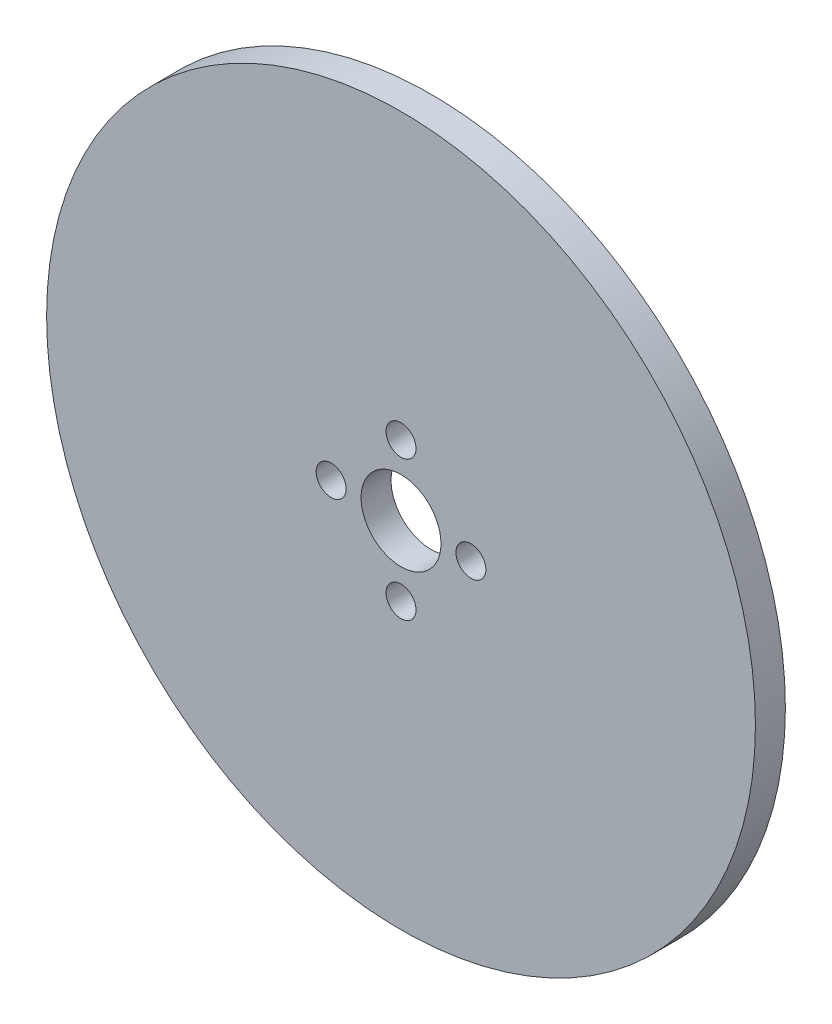
ISO-10303-21;
HEADER;
FILE_DESCRIPTION(('STEP AP214'),'2;1');
FILE_NAME('part.step','',(''),(''),'','','');
FILE_SCHEMA(('AUTOMOTIVE_DESIGN { 1 0 10303 214 1 1 1 1 }'));
ENDSEC;
DATA;
#1=APPLICATION_CONTEXT('core data for automotive mechanical design processes');
#2=APPLICATION_PROTOCOL_DEFINITION('international standard','automotive_design',2000,#1);
#3=PRODUCT_CONTEXT('',#1,'mechanical');
#4=PRODUCT('Part','Part','',(#3));
#5=PRODUCT_RELATED_PRODUCT_CATEGORY('part','',(#4));
#6=PRODUCT_DEFINITION_FORMATION('','',#4);
#7=PRODUCT_DEFINITION_CONTEXT('part definition',#1,'design');
#8=PRODUCT_DEFINITION('design','',#6,#7);
#9=PRODUCT_DEFINITION_SHAPE('','',#8);
#10=(LENGTH_UNIT() NAMED_UNIT(*) SI_UNIT(.MILLI.,.METRE.));
#11=(NAMED_UNIT(*) PLANE_ANGLE_UNIT() SI_UNIT($,.RADIAN.));
#12=(NAMED_UNIT(*) SI_UNIT($,.STERADIAN.) SOLID_ANGLE_UNIT());
#13=UNCERTAINTY_MEASURE_WITH_UNIT(LENGTH_MEASURE(1.E-05),#10,'distance_accuracy_value','');
#14=(GEOMETRIC_REPRESENTATION_CONTEXT(3) GLOBAL_UNCERTAINTY_ASSIGNED_CONTEXT((#13)) GLOBAL_UNIT_ASSIGNED_CONTEXT((#10,
#11,#12)) REPRESENTATION_CONTEXT('',''));
#15=CARTESIAN_POINT('',(0.,0.,0.));
#16=DIRECTION('',(0.,0.,1.));
#17=DIRECTION('',(1.,0.,0.));
#18=AXIS2_PLACEMENT_3D('',#15,#16,#17);
#19=CARTESIAN_POINT('',(0.,0.,3.));
#20=DIRECTION('',(0.,0.,1.));
#21=DIRECTION('',(1.,0.,0.));
#22=AXIS2_PLACEMENT_3D('',#19,#20,#21);
#23=PLANE('',#22);
#24=CARTESIAN_POINT('',(-7.,0.,3.));
#25=DIRECTION('',(0.,0.,1.));
#26=DIRECTION('',(1.,0.,0.));
#27=AXIS2_PLACEMENT_3D('',#24,#25,#26);
#28=CIRCLE('',#27,1.5);
#29=CARTESIAN_POINT('',(-5.5,0.,3.));
#30=VERTEX_POINT('',#29);
#31=EDGE_CURVE('E72',#30,#30,#28,.T.);
#32=ORIENTED_EDGE('',*,*,#31,.F.);
#33=EDGE_LOOP('',(#32));
#34=FACE_BOUND('',#33,.T.);
#35=CARTESIAN_POINT('',(7.,0.,3.));
#36=DIRECTION('',(0.,0.,1.));
#37=DIRECTION('',(1.,0.,0.));
#38=AXIS2_PLACEMENT_3D('',#35,#36,#37);
#39=CIRCLE('',#38,1.5);
#40=CARTESIAN_POINT('',(8.5,0.,3.));
#41=VERTEX_POINT('',#40);
#42=EDGE_CURVE('E56',#41,#41,#39,.T.);
#43=ORIENTED_EDGE('',*,*,#42,.F.);
#44=EDGE_LOOP('',(#43));
#45=FACE_BOUND('',#44,.T.);
#46=CARTESIAN_POINT('',(0.,0.,3.));
#47=DIRECTION('',(0.,0.,1.));
#48=DIRECTION('',(1.,0.,0.));
#49=AXIS2_PLACEMENT_3D('',#46,#47,#48);
#50=CIRCLE('',#49,35.5);
#51=CARTESIAN_POINT('',(35.5,0.,3.));
#52=VERTEX_POINT('',#51);
#53=EDGE_CURVE('E10',#52,#52,#50,.T.);
#54=ORIENTED_EDGE('',*,*,#53,.T.);
#55=EDGE_LOOP('',(#54));
#56=FACE_BOUND('',#55,.T.);
#57=CARTESIAN_POINT('',(0.,0.,3.));
#58=DIRECTION('',(0.,0.,1.));
#59=DIRECTION('',(1.,0.,0.));
#60=AXIS2_PLACEMENT_3D('',#57,#58,#59);
#61=CIRCLE('',#60,4.);
#62=CARTESIAN_POINT('',(4.,0.,3.));
#63=VERTEX_POINT('',#62);
#64=EDGE_CURVE('E50',#63,#63,#61,.T.);
#65=ORIENTED_EDGE('',*,*,#64,.F.);
#66=EDGE_LOOP('',(#65));
#67=FACE_BOUND('',#66,.T.);
#68=CARTESIAN_POINT('',(0.,-7.,3.));
#69=DIRECTION('',(0.,0.,1.));
#70=DIRECTION('',(1.,0.,0.));
#71=AXIS2_PLACEMENT_3D('',#68,#69,#70);
#72=CIRCLE('',#71,1.5);
#73=CARTESIAN_POINT('',(1.49999999999998,-7.,3.));
#74=VERTEX_POINT('',#73);
#75=EDGE_CURVE('E64',#74,#74,#72,.T.);
#76=ORIENTED_EDGE('',*,*,#75,.F.);
#77=EDGE_LOOP('',(#76));
#78=FACE_BOUND('',#77,.T.);
#79=CARTESIAN_POINT('',(0.,7.,3.));
#80=DIRECTION('',(0.,0.,1.));
#81=DIRECTION('',(1.,0.,0.));
#82=AXIS2_PLACEMENT_3D('',#79,#80,#81);
#83=CIRCLE('',#82,1.5);
#84=CARTESIAN_POINT('',(1.50000000000007,7.,3.));
#85=VERTEX_POINT('',#84);
#86=EDGE_CURVE('E80',#85,#85,#83,.T.);
#87=ORIENTED_EDGE('',*,*,#86,.F.);
#88=EDGE_LOOP('',(#87));
#89=FACE_BOUND('',#88,.T.);
#90=ADVANCED_FACE('F37',(#34,#45,#56,#67,#78,#89),#23,.T.);
#91=CARTESIAN_POINT('',(0.,0.,0.));
#92=DIRECTION('',(0.,0.,1.));
#93=DIRECTION('',(1.,0.,0.));
#94=AXIS2_PLACEMENT_3D('',#91,#92,#93);
#95=PLANE('',#94);
#96=CARTESIAN_POINT('',(0.,0.,0.));
#97=DIRECTION('',(0.,0.,1.));
#98=DIRECTION('',(1.,0.,0.));
#99=AXIS2_PLACEMENT_3D('',#96,#97,#98);
#100=CIRCLE('',#99,35.5);
#101=CARTESIAN_POINT('',(35.5,0.,0.));
#102=VERTEX_POINT('',#101);
#103=EDGE_CURVE('E41',#102,#102,#100,.T.);
#104=ORIENTED_EDGE('',*,*,#103,.F.);
#105=EDGE_LOOP('',(#104));
#106=FACE_BOUND('',#105,.T.);
#107=CARTESIAN_POINT('',(0.,0.,0.));
#108=DIRECTION('',(0.,0.,1.));
#109=DIRECTION('',(1.,0.,0.));
#110=AXIS2_PLACEMENT_3D('',#107,#108,#109);
#111=CIRCLE('',#110,4.);
#112=CARTESIAN_POINT('',(4.,0.,0.));
#113=VERTEX_POINT('',#112);
#114=EDGE_CURVE('E52',#113,#113,#111,.T.);
#115=ORIENTED_EDGE('',*,*,#114,.T.);
#116=EDGE_LOOP('',(#115));
#117=FACE_BOUND('',#116,.T.);
#118=CARTESIAN_POINT('',(7.,0.,0.));
#119=DIRECTION('',(0.,0.,1.));
#120=DIRECTION('',(1.,0.,0.));
#121=AXIS2_PLACEMENT_3D('',#118,#119,#120);
#122=CIRCLE('',#121,1.5);
#123=CARTESIAN_POINT('',(8.5,0.,0.));
#124=VERTEX_POINT('',#123);
#125=EDGE_CURVE('E60',#124,#124,#122,.T.);
#126=ORIENTED_EDGE('',*,*,#125,.T.);
#127=EDGE_LOOP('',(#126));
#128=FACE_BOUND('',#127,.T.);
#129=CARTESIAN_POINT('',(0.,-7.,0.));
#130=DIRECTION('',(0.,0.,1.));
#131=DIRECTION('',(1.,0.,0.));
#132=AXIS2_PLACEMENT_3D('',#129,#130,#131);
#133=CIRCLE('',#132,1.5);
#134=CARTESIAN_POINT('',(1.49999999999998,-7.,0.));
#135=VERTEX_POINT('',#134);
#136=EDGE_CURVE('E68',#135,#135,#133,.T.);
#137=ORIENTED_EDGE('',*,*,#136,.T.);
#138=EDGE_LOOP('',(#137));
#139=FACE_BOUND('',#138,.T.);
#140=CARTESIAN_POINT('',(-7.,0.,0.));
#141=DIRECTION('',(0.,0.,1.));
#142=DIRECTION('',(1.,0.,0.));
#143=AXIS2_PLACEMENT_3D('',#140,#141,#142);
#144=CIRCLE('',#143,1.5);
#145=CARTESIAN_POINT('',(-5.5,0.,0.));
#146=VERTEX_POINT('',#145);
#147=EDGE_CURVE('E76',#146,#146,#144,.T.);
#148=ORIENTED_EDGE('',*,*,#147,.T.);
#149=EDGE_LOOP('',(#148));
#150=FACE_BOUND('',#149,.T.);
#151=CARTESIAN_POINT('',(0.,7.,0.));
#152=DIRECTION('',(0.,0.,1.));
#153=DIRECTION('',(1.,0.,0.));
#154=AXIS2_PLACEMENT_3D('',#151,#152,#153);
#155=CIRCLE('',#154,1.5);
#156=CARTESIAN_POINT('',(1.50000000000007,7.,0.));
#157=VERTEX_POINT('',#156);
#158=EDGE_CURVE('E84',#157,#157,#155,.T.);
#159=ORIENTED_EDGE('',*,*,#158,.T.);
#160=EDGE_LOOP('',(#159));
#161=FACE_BOUND('',#160,.T.);
#162=ADVANCED_FACE('F96',(#106,#117,#128,#139,#150,#161),#95,.F.);
#163=CARTESIAN_POINT('',(0.,0.,3.));
#164=DIRECTION('',(0.,0.,-1.));
#165=DIRECTION('',(-1.,0.,0.));
#166=AXIS2_PLACEMENT_3D('',#163,#164,#165);
#167=CYLINDRICAL_SURFACE('',#166,35.5);
#168=ORIENTED_EDGE('',*,*,#53,.F.);
#169=EDGE_LOOP('',(#168));
#170=FACE_BOUND('',#169,.T.);
#171=ORIENTED_EDGE('',*,*,#103,.T.);
#172=EDGE_LOOP('',(#171));
#173=FACE_BOUND('',#172,.T.);
#174=ADVANCED_FACE('F39',(#170,#173),#167,.T.);
#175=CARTESIAN_POINT('',(0.,0.,3.));
#176=DIRECTION('',(0.,0.,-1.));
#177=DIRECTION('',(-1.,0.,0.));
#178=AXIS2_PLACEMENT_3D('',#175,#176,#177);
#179=CYLINDRICAL_SURFACE('',#178,4.);
#180=ORIENTED_EDGE('',*,*,#64,.T.);
#181=EDGE_LOOP('',(#180));
#182=FACE_BOUND('',#181,.T.);
#183=ORIENTED_EDGE('',*,*,#114,.F.);
#184=EDGE_LOOP('',(#183));
#185=FACE_BOUND('',#184,.T.);
#186=ADVANCED_FACE('F106',(#182,#185),#179,.F.);
#187=CARTESIAN_POINT('',(7.,0.,3.));
#188=DIRECTION('',(0.,0.,-1.));
#189=DIRECTION('',(-1.,0.,0.));
#190=AXIS2_PLACEMENT_3D('',#187,#188,#189);
#191=CYLINDRICAL_SURFACE('',#190,1.5);
#192=ORIENTED_EDGE('',*,*,#42,.T.);
#193=EDGE_LOOP('',(#192));
#194=FACE_BOUND('',#193,.T.);
#195=ORIENTED_EDGE('',*,*,#125,.F.);
#196=EDGE_LOOP('',(#195));
#197=FACE_BOUND('',#196,.T.);
#198=ADVANCED_FACE('F109',(#194,#197),#191,.F.);
#199=CARTESIAN_POINT('',(0.,-7.,3.));
#200=DIRECTION('',(0.,0.,-1.));
#201=DIRECTION('',(-1.,0.,0.));
#202=AXIS2_PLACEMENT_3D('',#199,#200,#201);
#203=CYLINDRICAL_SURFACE('',#202,1.5);
#204=ORIENTED_EDGE('',*,*,#75,.T.);
#205=EDGE_LOOP('',(#204));
#206=FACE_BOUND('',#205,.T.);
#207=ORIENTED_EDGE('',*,*,#136,.F.);
#208=EDGE_LOOP('',(#207));
#209=FACE_BOUND('',#208,.T.);
#210=ADVANCED_FACE('F113',(#206,#209),#203,.F.);
#211=CARTESIAN_POINT('',(-7.,0.,3.));
#212=DIRECTION('',(0.,0.,-1.));
#213=DIRECTION('',(-1.,0.,0.));
#214=AXIS2_PLACEMENT_3D('',#211,#212,#213);
#215=CYLINDRICAL_SURFACE('',#214,1.5);
#216=ORIENTED_EDGE('',*,*,#31,.T.);
#217=EDGE_LOOP('',(#216));
#218=FACE_BOUND('',#217,.T.);
#219=ORIENTED_EDGE('',*,*,#147,.F.);
#220=EDGE_LOOP('',(#219));
#221=FACE_BOUND('',#220,.T.);
#222=ADVANCED_FACE('F117',(#218,#221),#215,.F.);
#223=CARTESIAN_POINT('',(0.,7.,3.));
#224=DIRECTION('',(0.,0.,-1.));
#225=DIRECTION('',(-1.,0.,0.));
#226=AXIS2_PLACEMENT_3D('',#223,#224,#225);
#227=CYLINDRICAL_SURFACE('',#226,1.5);
#228=ORIENTED_EDGE('',*,*,#86,.T.);
#229=EDGE_LOOP('',(#228));
#230=FACE_BOUND('',#229,.T.);
#231=ORIENTED_EDGE('',*,*,#158,.F.);
#232=EDGE_LOOP('',(#231));
#233=FACE_BOUND('',#232,.T.);
#234=ADVANCED_FACE('F92',(#230,#233),#227,.F.);
#235=CLOSED_SHELL('',(#90,#162,#174,#186,#198,#210,#222,#234));
#236=MANIFOLD_SOLID_BREP('B2',#235);
#237=ADVANCED_BREP_SHAPE_REPRESENTATION('',(#18,#236),#14);
#238=SHAPE_DEFINITION_REPRESENTATION(#9,#237);
ENDSEC;
END-ISO-10303-21;
